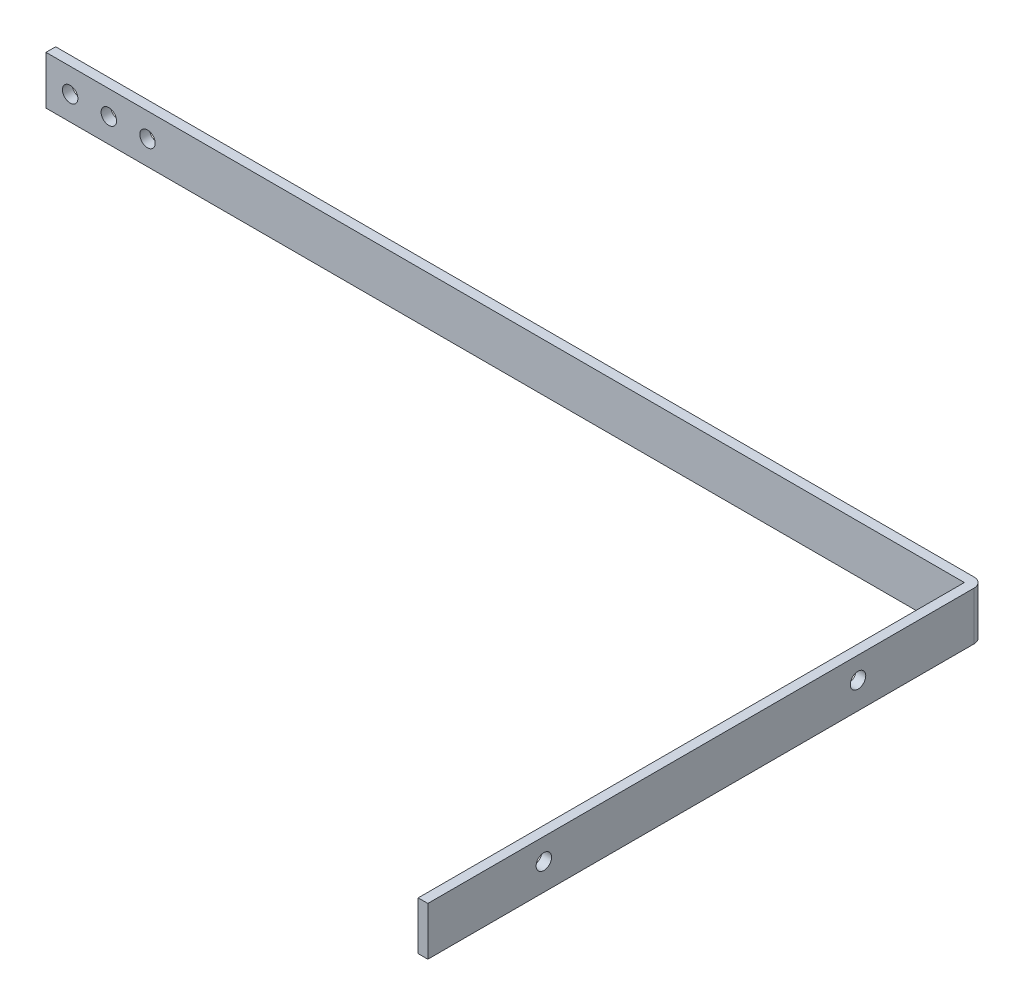
ISO-10303-21;
HEADER;
FILE_DESCRIPTION(('STEP AP214'),'2;1');
FILE_NAME('part.step','',(''),(''),'','','');
FILE_SCHEMA(('AUTOMOTIVE_DESIGN { 1 0 10303 214 1 1 1 1 }'));
ENDSEC;
DATA;
#1=APPLICATION_CONTEXT('core data for automotive mechanical design processes');
#2=APPLICATION_PROTOCOL_DEFINITION('international standard','automotive_design',2000,#1);
#3=PRODUCT_CONTEXT('',#1,'mechanical');
#4=PRODUCT('Part','Part','',(#3));
#5=PRODUCT_RELATED_PRODUCT_CATEGORY('part','',(#4));
#6=PRODUCT_DEFINITION_FORMATION('','',#4);
#7=PRODUCT_DEFINITION_CONTEXT('part definition',#1,'design');
#8=PRODUCT_DEFINITION('design','',#6,#7);
#9=PRODUCT_DEFINITION_SHAPE('','',#8);
#10=(LENGTH_UNIT() NAMED_UNIT(*) SI_UNIT(.MILLI.,.METRE.));
#11=(NAMED_UNIT(*) PLANE_ANGLE_UNIT() SI_UNIT($,.RADIAN.));
#12=(NAMED_UNIT(*) SI_UNIT($,.STERADIAN.) SOLID_ANGLE_UNIT());
#13=UNCERTAINTY_MEASURE_WITH_UNIT(LENGTH_MEASURE(1.E-05),#10,'distance_accuracy_value','');
#14=(GEOMETRIC_REPRESENTATION_CONTEXT(3) GLOBAL_UNCERTAINTY_ASSIGNED_CONTEXT((#13)) GLOBAL_UNIT_ASSIGNED_CONTEXT((#10,
#11,#12)) REPRESENTATION_CONTEXT('',''));
#15=CARTESIAN_POINT('',(0.,0.,0.));
#16=DIRECTION('',(0.,0.,1.));
#17=DIRECTION('',(1.,0.,0.));
#18=AXIS2_PLACEMENT_3D('',#15,#16,#17);
#19=CARTESIAN_POINT('',(0.,0.,2.));
#20=DIRECTION('',(0.,0.,-1.));
#21=DIRECTION('',(-1.,0.,0.));
#22=AXIS2_PLACEMENT_3D('',#19,#20,#21);
#23=PLANE('',#22);
#24=CARTESIAN_POINT('',(13.,5.,2.));
#25=DIRECTION('',(0.,0.,1.));
#26=DIRECTION('',(1.,0.,0.));
#27=AXIS2_PLACEMENT_3D('',#24,#25,#26);
#28=CIRCLE('',#27,1.6);
#29=CARTESIAN_POINT('',(14.6,5.,2.));
#30=VERTEX_POINT('',#29);
#31=EDGE_CURVE('E197',#30,#30,#28,.T.);
#32=ORIENTED_EDGE('',*,*,#31,.F.);
#33=EDGE_LOOP('',(#32));
#34=FACE_BOUND('',#33,.T.);
#35=DIRECTION('',(1.,0.,0.));
#36=VECTOR('',#35,1.);
#37=CARTESIAN_POINT('',(190.,0.,2.));
#38=LINE('',#37,#36);
#39=CARTESIAN_POINT('',(0.,0.,2.));
#40=VERTEX_POINT('',#39);
#41=CARTESIAN_POINT('',(190.,0.,2.));
#42=VERTEX_POINT('',#41);
#43=EDGE_CURVE('E153',#40,#42,#38,.T.);
#44=ORIENTED_EDGE('',*,*,#43,.T.);
#45=DIRECTION('',(0.,1.,0.));
#46=VECTOR('',#45,1.);
#47=CARTESIAN_POINT('',(190.,10.,2.));
#48=LINE('',#47,#46);
#49=CARTESIAN_POINT('',(190.,10.,2.));
#50=VERTEX_POINT('',#49);
#51=EDGE_CURVE('E117',#42,#50,#48,.T.);
#52=ORIENTED_EDGE('',*,*,#51,.T.);
#53=DIRECTION('',(-1.,0.,0.));
#54=VECTOR('',#53,1.);
#55=CARTESIAN_POINT('',(0.,10.,2.));
#56=LINE('',#55,#54);
#57=CARTESIAN_POINT('',(0.,10.,2.));
#58=VERTEX_POINT('',#57);
#59=EDGE_CURVE('E158',#50,#58,#56,.T.);
#60=ORIENTED_EDGE('',*,*,#59,.T.);
#61=DIRECTION('',(0.,-1.,0.));
#62=VECTOR('',#61,1.);
#63=CARTESIAN_POINT('',(0.,0.,2.));
#64=LINE('',#63,#62);
#65=EDGE_CURVE('E160',#58,#40,#64,.T.);
#66=ORIENTED_EDGE('',*,*,#65,.T.);
#67=EDGE_LOOP('',(#44,#52,#60,#66));
#68=FACE_BOUND('',#67,.T.);
#69=CARTESIAN_POINT('',(5.,5.,2.));
#70=DIRECTION('',(0.,0.,1.));
#71=DIRECTION('',(1.,0.,0.));
#72=AXIS2_PLACEMENT_3D('',#69,#70,#71);
#73=CIRCLE('',#72,1.6);
#74=CARTESIAN_POINT('',(6.6,5.,2.));
#75=VERTEX_POINT('',#74);
#76=EDGE_CURVE('E172',#75,#75,#73,.T.);
#77=ORIENTED_EDGE('',*,*,#76,.F.);
#78=EDGE_LOOP('',(#77));
#79=FACE_BOUND('',#78,.T.);
#80=CARTESIAN_POINT('',(21.,5.,2.));
#81=DIRECTION('',(0.,0.,1.));
#82=DIRECTION('',(1.,0.,0.));
#83=AXIS2_PLACEMENT_3D('',#80,#81,#82);
#84=CIRCLE('',#83,1.6);
#85=CARTESIAN_POINT('',(22.6,5.,2.));
#86=VERTEX_POINT('',#85);
#87=EDGE_CURVE('E121',#86,#86,#84,.T.);
#88=ORIENTED_EDGE('',*,*,#87,.F.);
#89=EDGE_LOOP('',(#88));
#90=FACE_BOUND('',#89,.T.);
#91=ADVANCED_FACE('F35',(#34,#68,#79,#90),#23,.F.);
#92=CARTESIAN_POINT('',(0.,0.,0.));
#93=DIRECTION('',(0.,0.,-1.));
#94=DIRECTION('',(-1.,0.,0.));
#95=AXIS2_PLACEMENT_3D('',#92,#93,#94);
#96=PLANE('',#95);
#97=CARTESIAN_POINT('',(13.,5.,0.));
#98=DIRECTION('',(0.,0.,1.));
#99=DIRECTION('',(1.,0.,0.));
#100=AXIS2_PLACEMENT_3D('',#97,#98,#99);
#101=CIRCLE('',#100,1.6);
#102=CARTESIAN_POINT('',(14.6,5.,0.));
#103=VERTEX_POINT('',#102);
#104=EDGE_CURVE('E195',#103,#103,#101,.T.);
#105=ORIENTED_EDGE('',*,*,#104,.T.);
#106=EDGE_LOOP('',(#105));
#107=FACE_BOUND('',#106,.T.);
#108=DIRECTION('',(-1.,0.,0.));
#109=VECTOR('',#108,1.);
#110=CARTESIAN_POINT('',(0.,10.,0.));
#111=LINE('',#110,#109);
#112=CARTESIAN_POINT('',(190.,10.,0.));
#113=VERTEX_POINT('',#112);
#114=CARTESIAN_POINT('',(0.,10.,0.));
#115=VERTEX_POINT('',#114);
#116=EDGE_CURVE('E171',#113,#115,#111,.T.);
#117=ORIENTED_EDGE('',*,*,#116,.F.);
#118=DIRECTION('',(0.,1.,0.));
#119=VECTOR('',#118,1.);
#120=CARTESIAN_POINT('',(190.,0.,0.));
#121=LINE('',#120,#119);
#122=CARTESIAN_POINT('',(190.,0.,0.));
#123=VERTEX_POINT('',#122);
#124=EDGE_CURVE('E43',#113,#123,#121,.F.);
#125=ORIENTED_EDGE('',*,*,#124,.T.);
#126=DIRECTION('',(1.,0.,0.));
#127=VECTOR('',#126,1.);
#128=CARTESIAN_POINT('',(190.,0.,0.));
#129=LINE('',#128,#127);
#130=CARTESIAN_POINT('',(0.,0.,0.));
#131=VERTEX_POINT('',#130);
#132=EDGE_CURVE('E169',#131,#123,#129,.T.);
#133=ORIENTED_EDGE('',*,*,#132,.F.);
#134=DIRECTION('',(0.,-1.,0.));
#135=VECTOR('',#134,1.);
#136=CARTESIAN_POINT('',(0.,0.,0.));
#137=LINE('',#136,#135);
#138=EDGE_CURVE('E155',#115,#131,#137,.T.);
#139=ORIENTED_EDGE('',*,*,#138,.F.);
#140=EDGE_LOOP('',(#117,#125,#133,#139));
#141=FACE_BOUND('',#140,.T.);
#142=CARTESIAN_POINT('',(5.,5.,0.));
#143=DIRECTION('',(0.,0.,1.));
#144=DIRECTION('',(1.,0.,0.));
#145=AXIS2_PLACEMENT_3D('',#142,#143,#144);
#146=CIRCLE('',#145,1.6);
#147=CARTESIAN_POINT('',(6.6,5.,0.));
#148=VERTEX_POINT('',#147);
#149=EDGE_CURVE('E166',#148,#148,#146,.T.);
#150=ORIENTED_EDGE('',*,*,#149,.T.);
#151=EDGE_LOOP('',(#150));
#152=FACE_BOUND('',#151,.T.);
#153=CARTESIAN_POINT('',(21.,5.,0.));
#154=DIRECTION('',(0.,0.,1.));
#155=DIRECTION('',(1.,0.,0.));
#156=AXIS2_PLACEMENT_3D('',#153,#154,#155);
#157=CIRCLE('',#156,1.6);
#158=CARTESIAN_POINT('',(22.6,5.,0.));
#159=VERTEX_POINT('',#158);
#160=EDGE_CURVE('E118',#159,#159,#157,.T.);
#161=ORIENTED_EDGE('',*,*,#160,.T.);
#162=EDGE_LOOP('',(#161));
#163=FACE_BOUND('',#162,.T.);
#164=ADVANCED_FACE('F179',(#107,#141,#152,#163),#96,.T.);
#165=CARTESIAN_POINT('',(190.,0.,2.));
#166=DIRECTION('',(0.,1.,0.));
#167=DIRECTION('',(0.,0.,1.));
#168=AXIS2_PLACEMENT_3D('',#165,#166,#167);
#169=PLANE('',#168);
#170=ORIENTED_EDGE('',*,*,#132,.T.);
#171=CARTESIAN_POINT('',(190.,0.,2.));
#172=DIRECTION('',(0.,1.,0.));
#173=DIRECTION('',(0.,0.,1.));
#174=AXIS2_PLACEMENT_3D('',#171,#172,#173);
#175=CIRCLE('',#174,2.);
#176=CARTESIAN_POINT('',(192.,0.,2.));
#177=VERTEX_POINT('',#176);
#178=EDGE_CURVE('E11',#123,#177,#175,.F.);
#179=ORIENTED_EDGE('',*,*,#178,.T.);
#180=DIRECTION('',(0.,0.,-1.));
#181=VECTOR('',#180,1.);
#182=CARTESIAN_POINT('',(192.,0.,115.));
#183=LINE('',#182,#181);
#184=CARTESIAN_POINT('',(192.,0.,115.));
#185=VERTEX_POINT('',#184);
#186=EDGE_CURVE('E101',#185,#177,#183,.T.);
#187=ORIENTED_EDGE('',*,*,#186,.F.);
#188=DIRECTION('',(1.,0.,0.));
#189=VECTOR('',#188,1.);
#190=CARTESIAN_POINT('',(192.,0.,115.));
#191=LINE('',#190,#189);
#192=CARTESIAN_POINT('',(190.,0.,115.));
#193=VERTEX_POINT('',#192);
#194=EDGE_CURVE('E93',#193,#185,#191,.T.);
#195=ORIENTED_EDGE('',*,*,#194,.F.);
#196=DIRECTION('',(0.,0.,-1.));
#197=VECTOR('',#196,1.);
#198=CARTESIAN_POINT('',(190.,0.,115.));
#199=LINE('',#198,#197);
#200=EDGE_CURVE('E98',#193,#42,#199,.T.);
#201=ORIENTED_EDGE('',*,*,#200,.T.);
#202=ORIENTED_EDGE('',*,*,#43,.F.);
#203=DIRECTION('',(0.,0.,-1.));
#204=VECTOR('',#203,1.);
#205=CARTESIAN_POINT('',(0.,0.,2.));
#206=LINE('',#205,#204);
#207=EDGE_CURVE('E148',#40,#131,#206,.T.);
#208=ORIENTED_EDGE('',*,*,#207,.T.);
#209=EDGE_LOOP('',(#170,#179,#187,#195,#201,#202,#208));
#210=FACE_BOUND('',#209,.T.);
#211=ADVANCED_FACE('F95',(#210),#169,.F.);
#212=CARTESIAN_POINT('',(0.,10.,2.));
#213=DIRECTION('',(0.,-1.,0.));
#214=DIRECTION('',(0.,0.,-1.));
#215=AXIS2_PLACEMENT_3D('',#212,#213,#214);
#216=PLANE('',#215);
#217=DIRECTION('',(0.,0.,-1.));
#218=VECTOR('',#217,1.);
#219=CARTESIAN_POINT('',(192.,10.,115.));
#220=LINE('',#219,#218);
#221=CARTESIAN_POINT('',(192.,10.,115.));
#222=VERTEX_POINT('',#221);
#223=CARTESIAN_POINT('',(192.,10.,2.));
#224=VERTEX_POINT('',#223);
#225=EDGE_CURVE('E123',#222,#224,#220,.T.);
#226=ORIENTED_EDGE('',*,*,#225,.T.);
#227=CARTESIAN_POINT('',(190.,10.,2.));
#228=DIRECTION('',(0.,-1.,0.));
#229=DIRECTION('',(0.,0.,-1.));
#230=AXIS2_PLACEMENT_3D('',#227,#228,#229);
#231=CIRCLE('',#230,2.);
#232=EDGE_CURVE('E57',#224,#113,#231,.F.);
#233=ORIENTED_EDGE('',*,*,#232,.T.);
#234=ORIENTED_EDGE('',*,*,#116,.T.);
#235=DIRECTION('',(0.,0.,-1.));
#236=VECTOR('',#235,1.);
#237=CARTESIAN_POINT('',(0.,10.,2.));
#238=LINE('',#237,#236);
#239=EDGE_CURVE('E144',#58,#115,#238,.T.);
#240=ORIENTED_EDGE('',*,*,#239,.F.);
#241=ORIENTED_EDGE('',*,*,#59,.F.);
#242=DIRECTION('',(0.,0.,-1.));
#243=VECTOR('',#242,1.);
#244=CARTESIAN_POINT('',(190.,10.,115.));
#245=LINE('',#244,#243);
#246=CARTESIAN_POINT('',(190.,10.,115.));
#247=VERTEX_POINT('',#246);
#248=EDGE_CURVE('E128',#247,#50,#245,.T.);
#249=ORIENTED_EDGE('',*,*,#248,.F.);
#250=DIRECTION('',(-1.,0.,0.));
#251=VECTOR('',#250,1.);
#252=CARTESIAN_POINT('',(190.,10.,115.));
#253=LINE('',#252,#251);
#254=EDGE_CURVE('E110',#222,#247,#253,.T.);
#255=ORIENTED_EDGE('',*,*,#254,.F.);
#256=EDGE_LOOP('',(#226,#233,#234,#240,#241,#249,#255));
#257=FACE_BOUND('',#256,.T.);
#258=ADVANCED_FACE('F136',(#257),#216,.F.);
#259=CARTESIAN_POINT('',(0.,0.,2.));
#260=DIRECTION('',(1.,0.,0.));
#261=DIRECTION('',(0.,0.,-1.));
#262=AXIS2_PLACEMENT_3D('',#259,#260,#261);
#263=PLANE('',#262);
#264=ORIENTED_EDGE('',*,*,#138,.T.);
#265=ORIENTED_EDGE('',*,*,#207,.F.);
#266=ORIENTED_EDGE('',*,*,#65,.F.);
#267=ORIENTED_EDGE('',*,*,#239,.T.);
#268=EDGE_LOOP('',(#264,#265,#266,#267));
#269=FACE_BOUND('',#268,.T.);
#270=ADVANCED_FACE('F181',(#269),#263,.F.);
#271=CARTESIAN_POINT('',(5.,5.,2.));
#272=DIRECTION('',(0.,0.,-1.));
#273=DIRECTION('',(-1.,0.,0.));
#274=AXIS2_PLACEMENT_3D('',#271,#272,#273);
#275=CYLINDRICAL_SURFACE('',#274,1.6);
#276=ORIENTED_EDGE('',*,*,#76,.T.);
#277=EDGE_LOOP('',(#276));
#278=FACE_BOUND('',#277,.T.);
#279=ORIENTED_EDGE('',*,*,#149,.F.);
#280=EDGE_LOOP('',(#279));
#281=FACE_BOUND('',#280,.T.);
#282=ADVANCED_FACE('F208',(#278,#281),#275,.F.);
#283=CARTESIAN_POINT('',(13.,5.,2.));
#284=DIRECTION('',(0.,0.,-1.));
#285=DIRECTION('',(-1.,0.,0.));
#286=AXIS2_PLACEMENT_3D('',#283,#284,#285);
#287=CYLINDRICAL_SURFACE('',#286,1.6);
#288=ORIENTED_EDGE('',*,*,#31,.T.);
#289=EDGE_LOOP('',(#288));
#290=FACE_BOUND('',#289,.T.);
#291=ORIENTED_EDGE('',*,*,#104,.F.);
#292=EDGE_LOOP('',(#291));
#293=FACE_BOUND('',#292,.T.);
#294=ADVANCED_FACE('F210',(#290,#293),#287,.F.);
#295=CARTESIAN_POINT('',(21.,5.,2.));
#296=DIRECTION('',(0.,0.,-1.));
#297=DIRECTION('',(-1.,0.,0.));
#298=AXIS2_PLACEMENT_3D('',#295,#296,#297);
#299=CYLINDRICAL_SURFACE('',#298,1.6);
#300=ORIENTED_EDGE('',*,*,#87,.T.);
#301=EDGE_LOOP('',(#300));
#302=FACE_BOUND('',#301,.T.);
#303=ORIENTED_EDGE('',*,*,#160,.F.);
#304=EDGE_LOOP('',(#303));
#305=FACE_BOUND('',#304,.T.);
#306=ADVANCED_FACE('F216',(#302,#305),#299,.F.);
#307=CARTESIAN_POINT('',(190.,0.,115.));
#308=DIRECTION('',(1.,0.,0.));
#309=DIRECTION('',(0.,0.,-1.));
#310=AXIS2_PLACEMENT_3D('',#307,#308,#309);
#311=PLANE('',#310);
#312=CARTESIAN_POINT('',(190.,5.5,26.));
#313=DIRECTION('',(1.,0.,0.));
#314=DIRECTION('',(0.,0.,-1.));
#315=AXIS2_PLACEMENT_3D('',#312,#313,#314);
#316=CIRCLE('',#315,1.6);
#317=CARTESIAN_POINT('',(190.,5.5,24.4));
#318=VERTEX_POINT('',#317);
#319=EDGE_CURVE('E336',#318,#318,#316,.F.);
#320=ORIENTED_EDGE('',*,*,#319,.F.);
#321=EDGE_LOOP('',(#320));
#322=FACE_BOUND('',#321,.T.);
#323=CARTESIAN_POINT('',(190.,5.5,91.));
#324=DIRECTION('',(1.,0.,0.));
#325=DIRECTION('',(0.,0.,-1.));
#326=AXIS2_PLACEMENT_3D('',#323,#324,#325);
#327=CIRCLE('',#326,1.60000000000001);
#328=CARTESIAN_POINT('',(190.,5.5,89.4));
#329=VERTEX_POINT('',#328);
#330=EDGE_CURVE('E113',#329,#329,#327,.F.);
#331=ORIENTED_EDGE('',*,*,#330,.F.);
#332=EDGE_LOOP('',(#331));
#333=FACE_BOUND('',#332,.T.);
#334=ORIENTED_EDGE('',*,*,#51,.F.);
#335=ORIENTED_EDGE('',*,*,#200,.F.);
#336=DIRECTION('',(0.,-1.,0.));
#337=VECTOR('',#336,1.);
#338=CARTESIAN_POINT('',(190.,0.,115.));
#339=LINE('',#338,#337);
#340=EDGE_CURVE('E105',#247,#193,#339,.T.);
#341=ORIENTED_EDGE('',*,*,#340,.F.);
#342=ORIENTED_EDGE('',*,*,#248,.T.);
#343=EDGE_LOOP('',(#334,#335,#341,#342));
#344=FACE_BOUND('',#343,.T.);
#345=ADVANCED_FACE('F115',(#322,#333,#344),#311,.F.);
#346=CARTESIAN_POINT('',(192.,10.,115.));
#347=DIRECTION('',(-1.,0.,0.));
#348=DIRECTION('',(0.,0.,1.));
#349=AXIS2_PLACEMENT_3D('',#346,#347,#348);
#350=PLANE('',#349);
#351=CARTESIAN_POINT('',(192.,5.5,26.));
#352=DIRECTION('',(1.,0.,0.));
#353=DIRECTION('',(0.,0.,-1.));
#354=AXIS2_PLACEMENT_3D('',#351,#352,#353);
#355=CIRCLE('',#354,1.6);
#356=CARTESIAN_POINT('',(192.,5.5,24.4));
#357=VERTEX_POINT('',#356);
#358=EDGE_CURVE('E333',#357,#357,#355,.T.);
#359=ORIENTED_EDGE('',*,*,#358,.F.);
#360=EDGE_LOOP('',(#359));
#361=FACE_BOUND('',#360,.T.);
#362=CARTESIAN_POINT('',(192.,5.5,91.));
#363=DIRECTION('',(1.,0.,0.));
#364=DIRECTION('',(0.,0.,-1.));
#365=AXIS2_PLACEMENT_3D('',#362,#363,#364);
#366=CIRCLE('',#365,1.60000000000001);
#367=CARTESIAN_POINT('',(192.,5.5,89.4));
#368=VERTEX_POINT('',#367);
#369=EDGE_CURVE('E337',#368,#368,#366,.T.);
#370=ORIENTED_EDGE('',*,*,#369,.F.);
#371=EDGE_LOOP('',(#370));
#372=FACE_BOUND('',#371,.T.);
#373=ORIENTED_EDGE('',*,*,#186,.T.);
#374=DIRECTION('',(0.,1.,0.));
#375=VECTOR('',#374,1.);
#376=CARTESIAN_POINT('',(192.,10.,2.));
#377=LINE('',#376,#375);
#378=EDGE_CURVE('E141',#177,#224,#377,.T.);
#379=ORIENTED_EDGE('',*,*,#378,.T.);
#380=ORIENTED_EDGE('',*,*,#225,.F.);
#381=DIRECTION('',(0.,1.,0.));
#382=VECTOR('',#381,1.);
#383=CARTESIAN_POINT('',(192.,10.,115.));
#384=LINE('',#383,#382);
#385=EDGE_CURVE('E104',#185,#222,#384,.T.);
#386=ORIENTED_EDGE('',*,*,#385,.F.);
#387=EDGE_LOOP('',(#373,#379,#380,#386));
#388=FACE_BOUND('',#387,.T.);
#389=ADVANCED_FACE('F139',(#361,#372,#388),#350,.F.);
#390=CARTESIAN_POINT('',(0.,0.,115.));
#391=DIRECTION('',(0.,0.,-1.));
#392=DIRECTION('',(-1.,0.,0.));
#393=AXIS2_PLACEMENT_3D('',#390,#391,#392);
#394=PLANE('',#393);
#395=ORIENTED_EDGE('',*,*,#340,.T.);
#396=ORIENTED_EDGE('',*,*,#194,.T.);
#397=ORIENTED_EDGE('',*,*,#385,.T.);
#398=ORIENTED_EDGE('',*,*,#254,.T.);
#399=EDGE_LOOP('',(#395,#396,#397,#398));
#400=FACE_BOUND('',#399,.T.);
#401=ADVANCED_FACE('F108',(#400),#394,.F.);
#402=CARTESIAN_POINT('',(190.,10.,2.));
#403=DIRECTION('',(0.,-1.,0.));
#404=DIRECTION('',(0.,0.,-1.));
#405=AXIS2_PLACEMENT_3D('',#402,#403,#404);
#406=CYLINDRICAL_SURFACE('',#405,2.);
#407=ORIENTED_EDGE('',*,*,#178,.F.);
#408=ORIENTED_EDGE('',*,*,#124,.F.);
#409=ORIENTED_EDGE('',*,*,#232,.F.);
#410=ORIENTED_EDGE('',*,*,#378,.F.);
#411=EDGE_LOOP('',(#407,#408,#409,#410));
#412=FACE_BOUND('',#411,.T.);
#413=ADVANCED_FACE('F37',(#412),#406,.T.);
#414=CARTESIAN_POINT('',(-0.00102499999998784,5.5,91.));
#415=DIRECTION('',(1.,0.,0.));
#416=DIRECTION('',(0.,0.,-1.));
#417=AXIS2_PLACEMENT_3D('',#414,#415,#416);
#418=CYLINDRICAL_SURFACE('',#417,1.60000000000001);
#419=ORIENTED_EDGE('',*,*,#369,.T.);
#420=EDGE_LOOP('',(#419));
#421=FACE_BOUND('',#420,.T.);
#422=ORIENTED_EDGE('',*,*,#330,.T.);
#423=EDGE_LOOP('',(#422));
#424=FACE_BOUND('',#423,.T.);
#425=ADVANCED_FACE('F311',(#421,#424),#418,.F.);
#426=CARTESIAN_POINT('',(-0.00102499999998784,5.5,26.));
#427=DIRECTION('',(1.,0.,0.));
#428=DIRECTION('',(0.,0.,-1.));
#429=AXIS2_PLACEMENT_3D('',#426,#427,#428);
#430=CYLINDRICAL_SURFACE('',#429,1.6);
#431=ORIENTED_EDGE('',*,*,#358,.T.);
#432=EDGE_LOOP('',(#431));
#433=FACE_BOUND('',#432,.T.);
#434=ORIENTED_EDGE('',*,*,#319,.T.);
#435=EDGE_LOOP('',(#434));
#436=FACE_BOUND('',#435,.T.);
#437=ADVANCED_FACE('F316',(#433,#436),#430,.F.);
#438=CLOSED_SHELL('',(#91,#164,#211,#258,#270,#282,#294,#306,#345,#389,#401,#413,#425,#437));
#439=MANIFOLD_SOLID_BREP('B2',#438);
#440=ADVANCED_BREP_SHAPE_REPRESENTATION('',(#18,#439),#14);
#441=SHAPE_DEFINITION_REPRESENTATION(#9,#440);
ENDSEC;
END-ISO-10303-21;
